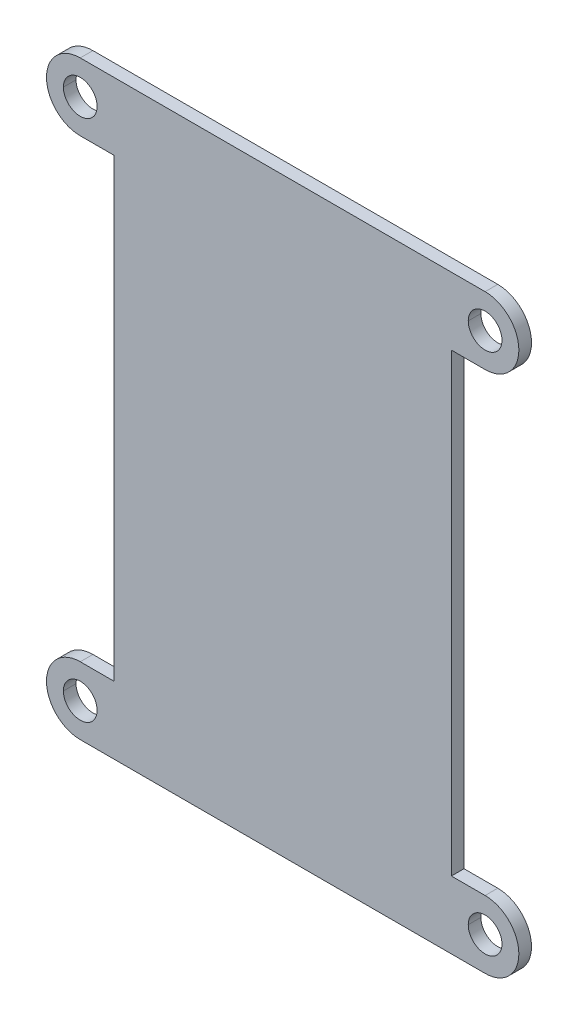
ISO-10303-21;
HEADER;
FILE_DESCRIPTION(('STEP AP214'),'2;1');
FILE_NAME('part.step','',(''),(''),'','','');
FILE_SCHEMA(('AUTOMOTIVE_DESIGN { 1 0 10303 214 1 1 1 1 }'));
ENDSEC;
DATA;
#1=APPLICATION_CONTEXT('core data for automotive mechanical design processes');
#2=APPLICATION_PROTOCOL_DEFINITION('international standard','automotive_design',2000,#1);
#3=PRODUCT_CONTEXT('',#1,'mechanical');
#4=PRODUCT('Part','Part','',(#3));
#5=PRODUCT_RELATED_PRODUCT_CATEGORY('part','',(#4));
#6=PRODUCT_DEFINITION_FORMATION('','',#4);
#7=PRODUCT_DEFINITION_CONTEXT('part definition',#1,'design');
#8=PRODUCT_DEFINITION('design','',#6,#7);
#9=PRODUCT_DEFINITION_SHAPE('','',#8);
#10=(LENGTH_UNIT() NAMED_UNIT(*) SI_UNIT(.MILLI.,.METRE.));
#11=(NAMED_UNIT(*) PLANE_ANGLE_UNIT() SI_UNIT($,.RADIAN.));
#12=(NAMED_UNIT(*) SI_UNIT($,.STERADIAN.) SOLID_ANGLE_UNIT());
#13=UNCERTAINTY_MEASURE_WITH_UNIT(LENGTH_MEASURE(1.E-05),#10,'distance_accuracy_value','');
#14=(GEOMETRIC_REPRESENTATION_CONTEXT(3) GLOBAL_UNCERTAINTY_ASSIGNED_CONTEXT((#13)) GLOBAL_UNIT_ASSIGNED_CONTEXT((#10,
#11,#12)) REPRESENTATION_CONTEXT('',''));
#15=CARTESIAN_POINT('',(0.,0.,0.));
#16=DIRECTION('',(0.,0.,1.));
#17=DIRECTION('',(1.,0.,0.));
#18=AXIS2_PLACEMENT_3D('',#15,#16,#17);
#19=CARTESIAN_POINT('',(1448.28873771887,2245.53731214958,1.5));
#20=DIRECTION('',(0.,0.,-1.));
#21=DIRECTION('',(-1.,0.,0.));
#22=AXIS2_PLACEMENT_3D('',#19,#20,#21);
#23=CYLINDRICAL_SURFACE('',#22,4.);
#24=CARTESIAN_POINT('',(1448.28873771887,2245.53731214958,1.5));
#25=DIRECTION('',(0.,0.,1.));
#26=DIRECTION('',(1.,0.,0.));
#27=AXIS2_PLACEMENT_3D('',#24,#25,#26);
#28=CIRCLE('',#27,4.);
#29=CARTESIAN_POINT('',(1444.28873771887,2245.53731214958,1.5));
#30=VERTEX_POINT('',#29);
#31=CARTESIAN_POINT('',(1448.28873771887,2241.53731214958,1.5));
#32=VERTEX_POINT('',#31);
#33=EDGE_CURVE('E42',#30,#32,#28,.T.);
#34=ORIENTED_EDGE('',*,*,#33,.F.);
#35=DIRECTION('',(0.,0.,-1.));
#36=VECTOR('',#35,1.);
#37=CARTESIAN_POINT('',(1444.28873771887,2245.53731214958,1.5));
#38=LINE('',#37,#36);
#39=CARTESIAN_POINT('',(1444.28873771887,2245.53731214958,0.));
#40=VERTEX_POINT('',#39);
#41=EDGE_CURVE('E11',#30,#40,#38,.T.);
#42=ORIENTED_EDGE('',*,*,#41,.T.);
#43=CARTESIAN_POINT('',(1448.28873771887,2245.53731214958,0.));
#44=DIRECTION('',(0.,0.,1.));
#45=DIRECTION('',(1.,0.,0.));
#46=AXIS2_PLACEMENT_3D('',#43,#44,#45);
#47=CIRCLE('',#46,4.);
#48=CARTESIAN_POINT('',(1448.28873771887,2241.53731214958,0.));
#49=VERTEX_POINT('',#48);
#50=EDGE_CURVE('E28',#40,#49,#47,.T.);
#51=ORIENTED_EDGE('',*,*,#50,.T.);
#52=DIRECTION('',(0.,0.,-1.));
#53=VECTOR('',#52,1.);
#54=CARTESIAN_POINT('',(1448.28873771887,2241.53731214958,1.5));
#55=LINE('',#54,#53);
#56=EDGE_CURVE('E300',#32,#49,#55,.T.);
#57=ORIENTED_EDGE('',*,*,#56,.F.);
#58=EDGE_LOOP('',(#34,#42,#51,#57));
#59=FACE_BOUND('',#58,.T.);
#60=ADVANCED_FACE('F17',(#59),#23,.T.);
#61=CARTESIAN_POINT('',(1496.28873771887,2245.53731214958,1.5));
#62=DIRECTION('',(0.,0.,-1.));
#63=DIRECTION('',(-1.,0.,0.));
#64=AXIS2_PLACEMENT_3D('',#61,#62,#63);
#65=CYLINDRICAL_SURFACE('',#64,1.99999999646993);
#66=CARTESIAN_POINT('',(1496.28873771887,2245.53731214958,1.5));
#67=DIRECTION('',(0.,0.,1.));
#68=DIRECTION('',(1.,0.,0.));
#69=AXIS2_PLACEMENT_3D('',#66,#67,#68);
#70=CIRCLE('',#69,1.99999999646993);
#71=CARTESIAN_POINT('',(1494.2887377224,2245.53731214958,1.5));
#72=VERTEX_POINT('',#71);
#73=CARTESIAN_POINT('',(1498.28873771534,2245.53731214958,1.5));
#74=VERTEX_POINT('',#73);
#75=EDGE_CURVE('E402',#72,#74,#70,.T.);
#76=ORIENTED_EDGE('',*,*,#75,.T.);
#77=DIRECTION('',(0.,0.,-1.));
#78=VECTOR('',#77,1.);
#79=CARTESIAN_POINT('',(1498.28873771534,2245.53731214958,1.5));
#80=LINE('',#79,#78);
#81=CARTESIAN_POINT('',(1498.28873771534,2245.53731214958,0.));
#82=VERTEX_POINT('',#81);
#83=EDGE_CURVE('E245',#74,#82,#80,.T.);
#84=ORIENTED_EDGE('',*,*,#83,.T.);
#85=CARTESIAN_POINT('',(1496.28873771887,2245.53731214958,0.));
#86=DIRECTION('',(0.,0.,1.));
#87=DIRECTION('',(1.,0.,0.));
#88=AXIS2_PLACEMENT_3D('',#85,#86,#87);
#89=CIRCLE('',#88,1.99999999646993);
#90=CARTESIAN_POINT('',(1494.2887377224,2245.53731214958,0.));
#91=VERTEX_POINT('',#90);
#92=EDGE_CURVE('E310',#91,#82,#89,.T.);
#93=ORIENTED_EDGE('',*,*,#92,.F.);
#94=DIRECTION('',(0.,0.,-1.));
#95=VECTOR('',#94,1.);
#96=CARTESIAN_POINT('',(1494.2887377224,2245.53731214958,1.5));
#97=LINE('',#96,#95);
#98=EDGE_CURVE('E423',#72,#91,#97,.T.);
#99=ORIENTED_EDGE('',*,*,#98,.F.);
#100=EDGE_LOOP('',(#76,#84,#93,#99));
#101=FACE_BOUND('',#100,.T.);
#102=ADVANCED_FACE('F490',(#101),#65,.F.);
#103=CARTESIAN_POINT('',(1448.28873771887,2245.53731214958,1.5));
#104=DIRECTION('',(0.,0.,-1.));
#105=DIRECTION('',(-1.,0.,0.));
#106=AXIS2_PLACEMENT_3D('',#103,#104,#105);
#107=CYLINDRICAL_SURFACE('',#106,2.00000000352984);
#108=CARTESIAN_POINT('',(1448.28873771887,2245.53731214958,1.5));
#109=DIRECTION('',(0.,0.,1.));
#110=DIRECTION('',(1.,0.,0.));
#111=AXIS2_PLACEMENT_3D('',#108,#109,#110);
#112=CIRCLE('',#111,2.00000000352984);
#113=CARTESIAN_POINT('',(1446.28873771534,2245.53731214958,1.5));
#114=VERTEX_POINT('',#113);
#115=CARTESIAN_POINT('',(1450.2887377224,2245.53731214958,1.5));
#116=VERTEX_POINT('',#115);
#117=EDGE_CURVE('E230',#114,#116,#112,.T.);
#118=ORIENTED_EDGE('',*,*,#117,.T.);
#119=DIRECTION('',(0.,0.,-1.));
#120=VECTOR('',#119,1.);
#121=CARTESIAN_POINT('',(1450.2887377224,2245.53731214958,1.5));
#122=LINE('',#121,#120);
#123=CARTESIAN_POINT('',(1450.2887377224,2245.53731214958,0.));
#124=VERTEX_POINT('',#123);
#125=EDGE_CURVE('E246',#116,#124,#122,.T.);
#126=ORIENTED_EDGE('',*,*,#125,.T.);
#127=CARTESIAN_POINT('',(1448.28873771887,2245.53731214958,0.));
#128=DIRECTION('',(0.,0.,1.));
#129=DIRECTION('',(1.,0.,0.));
#130=AXIS2_PLACEMENT_3D('',#127,#128,#129);
#131=CIRCLE('',#130,2.00000000352984);
#132=CARTESIAN_POINT('',(1446.28873771534,2245.53731214958,0.));
#133=VERTEX_POINT('',#132);
#134=EDGE_CURVE('E232',#133,#124,#131,.T.);
#135=ORIENTED_EDGE('',*,*,#134,.F.);
#136=DIRECTION('',(0.,0.,-1.));
#137=VECTOR('',#136,1.);
#138=CARTESIAN_POINT('',(1446.28873771534,2245.53731214958,1.5));
#139=LINE('',#138,#137);
#140=EDGE_CURVE('E226',#114,#133,#139,.T.);
#141=ORIENTED_EDGE('',*,*,#140,.F.);
#142=EDGE_LOOP('',(#118,#126,#135,#141));
#143=FACE_BOUND('',#142,.T.);
#144=ADVANCED_FACE('F228',(#143),#107,.F.);
#145=CARTESIAN_POINT('',(1496.28873771887,2307.53731214958,1.5));
#146=DIRECTION('',(0.,0.,-1.));
#147=DIRECTION('',(-1.,0.,0.));
#148=AXIS2_PLACEMENT_3D('',#145,#146,#147);
#149=CYLINDRICAL_SURFACE('',#148,1.99999999646993);
#150=CARTESIAN_POINT('',(1496.28873771887,2307.53731214958,1.5));
#151=DIRECTION('',(0.,0.,1.));
#152=DIRECTION('',(1.,0.,0.));
#153=AXIS2_PLACEMENT_3D('',#150,#151,#152);
#154=CIRCLE('',#153,1.99999999646993);
#155=CARTESIAN_POINT('',(1494.2887377224,2307.53731214958,1.5));
#156=VERTEX_POINT('',#155);
#157=CARTESIAN_POINT('',(1498.28873771534,2307.53731214958,1.5));
#158=VERTEX_POINT('',#157);
#159=EDGE_CURVE('E330',#156,#158,#154,.T.);
#160=ORIENTED_EDGE('',*,*,#159,.T.);
#161=DIRECTION('',(0.,0.,-1.));
#162=VECTOR('',#161,1.);
#163=CARTESIAN_POINT('',(1498.28873771534,2307.53731214958,1.5));
#164=LINE('',#163,#162);
#165=CARTESIAN_POINT('',(1498.28873771534,2307.53731214958,0.));
#166=VERTEX_POINT('',#165);
#167=EDGE_CURVE('E413',#158,#166,#164,.T.);
#168=ORIENTED_EDGE('',*,*,#167,.T.);
#169=CARTESIAN_POINT('',(1496.28873771887,2307.53731214958,0.));
#170=DIRECTION('',(0.,0.,1.));
#171=DIRECTION('',(1.,0.,0.));
#172=AXIS2_PLACEMENT_3D('',#169,#170,#171);
#173=CIRCLE('',#172,1.99999999646993);
#174=CARTESIAN_POINT('',(1494.2887377224,2307.53731214958,0.));
#175=VERTEX_POINT('',#174);
#176=EDGE_CURVE('E366',#175,#166,#173,.T.);
#177=ORIENTED_EDGE('',*,*,#176,.F.);
#178=DIRECTION('',(0.,0.,-1.));
#179=VECTOR('',#178,1.);
#180=CARTESIAN_POINT('',(1494.2887377224,2307.53731214958,1.5));
#181=LINE('',#180,#179);
#182=EDGE_CURVE('E249',#156,#175,#181,.T.);
#183=ORIENTED_EDGE('',*,*,#182,.F.);
#184=EDGE_LOOP('',(#160,#168,#177,#183));
#185=FACE_BOUND('',#184,.T.);
#186=ADVANCED_FACE('F822',(#185),#149,.F.);
#187=CARTESIAN_POINT('',(1448.28873771887,2307.53731214958,1.5));
#188=DIRECTION('',(0.,0.,-1.));
#189=DIRECTION('',(-1.,0.,0.));
#190=AXIS2_PLACEMENT_3D('',#187,#188,#189);
#191=CYLINDRICAL_SURFACE('',#190,2.00000000352984);
#192=CARTESIAN_POINT('',(1448.28873771887,2307.53731214958,1.5));
#193=DIRECTION('',(0.,0.,1.));
#194=DIRECTION('',(1.,0.,0.));
#195=AXIS2_PLACEMENT_3D('',#192,#193,#194);
#196=CIRCLE('',#195,2.00000000352984);
#197=CARTESIAN_POINT('',(1446.28873771534,2307.53731214958,1.5));
#198=VERTEX_POINT('',#197);
#199=CARTESIAN_POINT('',(1450.2887377224,2307.53731214958,1.5));
#200=VERTEX_POINT('',#199);
#201=EDGE_CURVE('E410',#198,#200,#196,.T.);
#202=ORIENTED_EDGE('',*,*,#201,.T.);
#203=DIRECTION('',(0.,0.,-1.));
#204=VECTOR('',#203,1.);
#205=CARTESIAN_POINT('',(1450.2887377224,2307.53731214958,1.5));
#206=LINE('',#205,#204);
#207=CARTESIAN_POINT('',(1450.2887377224,2307.53731214958,0.));
#208=VERTEX_POINT('',#207);
#209=EDGE_CURVE('E124',#200,#208,#206,.T.);
#210=ORIENTED_EDGE('',*,*,#209,.T.);
#211=CARTESIAN_POINT('',(1448.28873771887,2307.53731214958,0.));
#212=DIRECTION('',(0.,0.,1.));
#213=DIRECTION('',(1.,0.,0.));
#214=AXIS2_PLACEMENT_3D('',#211,#212,#213);
#215=CIRCLE('',#214,2.00000000352984);
#216=CARTESIAN_POINT('',(1446.28873771534,2307.53731214958,0.));
#217=VERTEX_POINT('',#216);
#218=EDGE_CURVE('E111',#217,#208,#215,.T.);
#219=ORIENTED_EDGE('',*,*,#218,.F.);
#220=DIRECTION('',(0.,0.,-1.));
#221=VECTOR('',#220,1.);
#222=CARTESIAN_POINT('',(1446.28873771534,2307.53731214958,1.5));
#223=LINE('',#222,#221);
#224=EDGE_CURVE('E387',#198,#217,#223,.T.);
#225=ORIENTED_EDGE('',*,*,#224,.F.);
#226=EDGE_LOOP('',(#202,#210,#219,#225));
#227=FACE_BOUND('',#226,.T.);
#228=ADVANCED_FACE('F470',(#227),#191,.F.);
#229=CARTESIAN_POINT('',(1448.28873771887,2307.53731214958,1.5));
#230=DIRECTION('',(0.,0.,-1.));
#231=DIRECTION('',(-1.,0.,0.));
#232=AXIS2_PLACEMENT_3D('',#229,#230,#231);
#233=CYLINDRICAL_SURFACE('',#232,4.);
#234=CARTESIAN_POINT('',(1448.28873771887,2307.53731214958,1.5));
#235=DIRECTION('',(0.,0.,1.));
#236=DIRECTION('',(1.,0.,0.));
#237=AXIS2_PLACEMENT_3D('',#234,#235,#236);
#238=CIRCLE('',#237,4.);
#239=CARTESIAN_POINT('',(1444.28873771887,2307.53731214958,1.5));
#240=VERTEX_POINT('',#239);
#241=CARTESIAN_POINT('',(1448.28873771887,2303.53731214958,1.5));
#242=VERTEX_POINT('',#241);
#243=EDGE_CURVE('E383',#240,#242,#238,.T.);
#244=ORIENTED_EDGE('',*,*,#243,.F.);
#245=DIRECTION('',(0.,0.,-1.));
#246=VECTOR('',#245,1.);
#247=CARTESIAN_POINT('',(1444.28873771887,2307.53731214958,1.5));
#248=LINE('',#247,#246);
#249=CARTESIAN_POINT('',(1444.28873771887,2307.53731214958,0.));
#250=VERTEX_POINT('',#249);
#251=EDGE_CURVE('E279',#240,#250,#248,.T.);
#252=ORIENTED_EDGE('',*,*,#251,.T.);
#253=CARTESIAN_POINT('',(1448.28873771887,2307.53731214958,0.));
#254=DIRECTION('',(0.,0.,1.));
#255=DIRECTION('',(1.,0.,0.));
#256=AXIS2_PLACEMENT_3D('',#253,#254,#255);
#257=CIRCLE('',#256,4.);
#258=CARTESIAN_POINT('',(1448.28873771887,2303.53731214958,0.));
#259=VERTEX_POINT('',#258);
#260=EDGE_CURVE('E283',#250,#259,#257,.T.);
#261=ORIENTED_EDGE('',*,*,#260,.T.);
#262=DIRECTION('',(0.,0.,-1.));
#263=VECTOR('',#262,1.);
#264=CARTESIAN_POINT('',(1448.28873771887,2303.53731214958,1.5));
#265=LINE('',#264,#263);
#266=EDGE_CURVE('E277',#242,#259,#265,.T.);
#267=ORIENTED_EDGE('',*,*,#266,.F.);
#268=EDGE_LOOP('',(#244,#252,#261,#267));
#269=FACE_BOUND('',#268,.T.);
#270=ADVANCED_FACE('F505',(#269),#233,.T.);
#271=CARTESIAN_POINT('',(0.,2241.53731214958,1.5));
#272=DIRECTION('',(0.,1.,0.));
#273=DIRECTION('',(1.,0.,0.));
#274=AXIS2_PLACEMENT_3D('',#271,#272,#273);
#275=PLANE('',#274);
#276=DIRECTION('',(1.,0.,0.));
#277=VECTOR('',#276,1.);
#278=CARTESIAN_POINT('',(0.,2241.53731214958,0.));
#279=LINE('',#278,#277);
#280=CARTESIAN_POINT('',(1496.28873771887,2241.53731214958,0.));
#281=VERTEX_POINT('',#280);
#282=EDGE_CURVE('E296',#49,#281,#279,.T.);
#283=ORIENTED_EDGE('',*,*,#282,.T.);
#284=DIRECTION('',(0.,0.,-1.));
#285=VECTOR('',#284,1.);
#286=CARTESIAN_POINT('',(1496.28873771887,2241.53731214958,1.5));
#287=LINE('',#286,#285);
#288=CARTESIAN_POINT('',(1496.28873771887,2241.53731214958,1.5));
#289=VERTEX_POINT('',#288);
#290=EDGE_CURVE('E331',#289,#281,#287,.T.);
#291=ORIENTED_EDGE('',*,*,#290,.F.);
#292=DIRECTION('',(1.,0.,0.));
#293=VECTOR('',#292,1.);
#294=CARTESIAN_POINT('',(0.,2241.53731214958,1.5));
#295=LINE('',#294,#293);
#296=EDGE_CURVE('E327',#32,#289,#295,.T.);
#297=ORIENTED_EDGE('',*,*,#296,.F.);
#298=ORIENTED_EDGE('',*,*,#56,.T.);
#299=EDGE_LOOP('',(#283,#291,#297,#298));
#300=FACE_BOUND('',#299,.T.);
#301=ADVANCED_FACE('F501',(#300),#275,.F.);
#302=CARTESIAN_POINT('',(1496.28873771887,2245.53731214958,1.5));
#303=DIRECTION('',(0.,0.,-1.));
#304=DIRECTION('',(-1.,0.,0.));
#305=AXIS2_PLACEMENT_3D('',#302,#303,#304);
#306=CYLINDRICAL_SURFACE('',#305,4.);
#307=CARTESIAN_POINT('',(1496.28873771887,2245.53731214958,0.));
#308=DIRECTION('',(0.,0.,1.));
#309=DIRECTION('',(1.,0.,0.));
#310=AXIS2_PLACEMENT_3D('',#307,#308,#309);
#311=CIRCLE('',#310,4.);
#312=CARTESIAN_POINT('',(1496.28873771887,2249.53731214958,0.));
#313=VERTEX_POINT('',#312);
#314=EDGE_CURVE('E334',#281,#313,#311,.T.);
#315=ORIENTED_EDGE('',*,*,#314,.T.);
#316=DIRECTION('',(0.,0.,-1.));
#317=VECTOR('',#316,1.);
#318=CARTESIAN_POINT('',(1496.28873771887,2249.53731214958,1.5));
#319=LINE('',#318,#317);
#320=CARTESIAN_POINT('',(1496.28873771887,2249.53731214958,1.5));
#321=VERTEX_POINT('',#320);
#322=EDGE_CURVE('E21',#321,#313,#319,.T.);
#323=ORIENTED_EDGE('',*,*,#322,.F.);
#324=CARTESIAN_POINT('',(1496.28873771887,2245.53731214958,1.5));
#325=DIRECTION('',(0.,0.,1.));
#326=DIRECTION('',(1.,0.,0.));
#327=AXIS2_PLACEMENT_3D('',#324,#325,#326);
#328=CIRCLE('',#327,4.);
#329=EDGE_CURVE('E361',#289,#321,#328,.T.);
#330=ORIENTED_EDGE('',*,*,#329,.F.);
#331=ORIENTED_EDGE('',*,*,#290,.T.);
#332=EDGE_LOOP('',(#315,#323,#330,#331));
#333=FACE_BOUND('',#332,.T.);
#334=ADVANCED_FACE('F504',(#333),#306,.T.);
#335=CARTESIAN_POINT('',(0.,2249.53731214958,1.5));
#336=DIRECTION('',(0.,-1.,0.));
#337=DIRECTION('',(0.,0.,-1.));
#338=AXIS2_PLACEMENT_3D('',#335,#336,#337);
#339=PLANE('',#338);
#340=DIRECTION('',(-1.,0.,0.));
#341=VECTOR('',#340,1.);
#342=CARTESIAN_POINT('',(0.,2249.53731214958,0.));
#343=LINE('',#342,#341);
#344=CARTESIAN_POINT('',(1492.28873771887,2249.53731214958,0.));
#345=VERTEX_POINT('',#344);
#346=EDGE_CURVE('E335',#313,#345,#343,.T.);
#347=ORIENTED_EDGE('',*,*,#346,.T.);
#348=DIRECTION('',(0.,0.,-1.));
#349=VECTOR('',#348,1.);
#350=CARTESIAN_POINT('',(1492.28873771887,2249.53731214958,1.5));
#351=LINE('',#350,#349);
#352=CARTESIAN_POINT('',(1492.28873771887,2249.53731214958,1.5));
#353=VERTEX_POINT('',#352);
#354=EDGE_CURVE('E292',#353,#345,#351,.T.);
#355=ORIENTED_EDGE('',*,*,#354,.F.);
#356=DIRECTION('',(-1.,0.,0.));
#357=VECTOR('',#356,1.);
#358=CARTESIAN_POINT('',(0.,2249.53731214958,1.5));
#359=LINE('',#358,#357);
#360=EDGE_CURVE('E372',#321,#353,#359,.T.);
#361=ORIENTED_EDGE('',*,*,#360,.F.);
#362=ORIENTED_EDGE('',*,*,#322,.T.);
#363=EDGE_LOOP('',(#347,#355,#361,#362));
#364=FACE_BOUND('',#363,.T.);
#365=ADVANCED_FACE('F507',(#364),#339,.F.);
#366=CARTESIAN_POINT('',(1492.28873771887,0.,1.5));
#367=DIRECTION('',(1.,0.,0.));
#368=DIRECTION('',(0.,1.,0.));
#369=AXIS2_PLACEMENT_3D('',#366,#367,#368);
#370=PLANE('',#369);
#371=DIRECTION('',(0.,-1.,0.));
#372=VECTOR('',#371,1.);
#373=CARTESIAN_POINT('',(1492.28873771887,0.,0.));
#374=LINE('',#373,#372);
#375=CARTESIAN_POINT('',(1492.28873771887,2303.53731214958,0.));
#376=VERTEX_POINT('',#375);
#377=EDGE_CURVE('E313',#376,#345,#374,.T.);
#378=ORIENTED_EDGE('',*,*,#377,.F.);
#379=DIRECTION('',(0.,0.,-1.));
#380=VECTOR('',#379,1.);
#381=CARTESIAN_POINT('',(1492.28873771887,2303.53731214958,1.5));
#382=LINE('',#381,#380);
#383=CARTESIAN_POINT('',(1492.28873771887,2303.53731214958,1.5));
#384=VERTEX_POINT('',#383);
#385=EDGE_CURVE('E262',#384,#376,#382,.T.);
#386=ORIENTED_EDGE('',*,*,#385,.F.);
#387=DIRECTION('',(0.,-1.,0.));
#388=VECTOR('',#387,1.);
#389=CARTESIAN_POINT('',(1492.28873771887,0.,1.5));
#390=LINE('',#389,#388);
#391=EDGE_CURVE('E288',#384,#353,#390,.T.);
#392=ORIENTED_EDGE('',*,*,#391,.T.);
#393=ORIENTED_EDGE('',*,*,#354,.T.);
#394=EDGE_LOOP('',(#378,#386,#392,#393));
#395=FACE_BOUND('',#394,.T.);
#396=ADVANCED_FACE('F510',(#395),#370,.T.);
#397=CARTESIAN_POINT('',(0.,2303.53731214958,1.5));
#398=DIRECTION('',(0.,-1.,0.));
#399=DIRECTION('',(0.,0.,-1.));
#400=AXIS2_PLACEMENT_3D('',#397,#398,#399);
#401=PLANE('',#400);
#402=DIRECTION('',(-1.,0.,0.));
#403=VECTOR('',#402,1.);
#404=CARTESIAN_POINT('',(0.,2303.53731214958,0.));
#405=LINE('',#404,#403);
#406=CARTESIAN_POINT('',(1496.28873771887,2303.53731214958,0.));
#407=VERTEX_POINT('',#406);
#408=EDGE_CURVE('E287',#407,#376,#405,.T.);
#409=ORIENTED_EDGE('',*,*,#408,.F.);
#410=DIRECTION('',(0.,0.,-1.));
#411=VECTOR('',#410,1.);
#412=CARTESIAN_POINT('',(1496.28873771887,2303.53731214958,1.5));
#413=LINE('',#412,#411);
#414=CARTESIAN_POINT('',(1496.28873771887,2303.53731214958,1.5));
#415=VERTEX_POINT('',#414);
#416=EDGE_CURVE('E318',#415,#407,#413,.T.);
#417=ORIENTED_EDGE('',*,*,#416,.F.);
#418=DIRECTION('',(-1.,0.,0.));
#419=VECTOR('',#418,1.);
#420=CARTESIAN_POINT('',(0.,2303.53731214958,1.5));
#421=LINE('',#420,#419);
#422=EDGE_CURVE('E265',#415,#384,#421,.T.);
#423=ORIENTED_EDGE('',*,*,#422,.T.);
#424=ORIENTED_EDGE('',*,*,#385,.T.);
#425=EDGE_LOOP('',(#409,#417,#423,#424));
#426=FACE_BOUND('',#425,.T.);
#427=ADVANCED_FACE('F499',(#426),#401,.T.);
#428=CARTESIAN_POINT('',(1496.28873771887,2307.53731214958,1.5));
#429=DIRECTION('',(0.,0.,-1.));
#430=DIRECTION('',(-1.,0.,0.));
#431=AXIS2_PLACEMENT_3D('',#428,#429,#430);
#432=CYLINDRICAL_SURFACE('',#431,4.);
#433=CARTESIAN_POINT('',(1496.28873771887,2307.53731214958,0.));
#434=DIRECTION('',(0.,0.,1.));
#435=DIRECTION('',(1.,0.,0.));
#436=AXIS2_PLACEMENT_3D('',#433,#434,#435);
#437=CIRCLE('',#436,4.);
#438=CARTESIAN_POINT('',(1496.28873771887,2311.53731214958,0.));
#439=VERTEX_POINT('',#438);
#440=EDGE_CURVE('E266',#407,#439,#437,.T.);
#441=ORIENTED_EDGE('',*,*,#440,.T.);
#442=DIRECTION('',(0.,0.,-1.));
#443=VECTOR('',#442,1.);
#444=CARTESIAN_POINT('',(1496.28873771887,2311.53731214958,1.5));
#445=LINE('',#444,#443);
#446=CARTESIAN_POINT('',(1496.28873771887,2311.53731214958,1.5));
#447=VERTEX_POINT('',#446);
#448=EDGE_CURVE('E355',#447,#439,#445,.T.);
#449=ORIENTED_EDGE('',*,*,#448,.F.);
#450=CARTESIAN_POINT('',(1496.28873771887,2307.53731214958,1.5));
#451=DIRECTION('',(0.,0.,1.));
#452=DIRECTION('',(1.,0.,0.));
#453=AXIS2_PLACEMENT_3D('',#450,#451,#452);
#454=CIRCLE('',#453,4.);
#455=EDGE_CURVE('E261',#415,#447,#454,.T.);
#456=ORIENTED_EDGE('',*,*,#455,.F.);
#457=ORIENTED_EDGE('',*,*,#416,.T.);
#458=EDGE_LOOP('',(#441,#449,#456,#457));
#459=FACE_BOUND('',#458,.T.);
#460=ADVANCED_FACE('F516',(#459),#432,.T.);
#461=CARTESIAN_POINT('',(0.,2311.53731214958,1.5));
#462=DIRECTION('',(0.,1.,0.));
#463=DIRECTION('',(1.,0.,0.));
#464=AXIS2_PLACEMENT_3D('',#461,#462,#463);
#465=PLANE('',#464);
#466=DIRECTION('',(1.,0.,0.));
#467=VECTOR('',#466,1.);
#468=CARTESIAN_POINT('',(0.,2311.53731214958,0.));
#469=LINE('',#468,#467);
#470=CARTESIAN_POINT('',(1448.28873771887,2311.53731214958,0.));
#471=VERTEX_POINT('',#470);
#472=EDGE_CURVE('E272',#471,#439,#469,.T.);
#473=ORIENTED_EDGE('',*,*,#472,.F.);
#474=DIRECTION('',(0.,0.,-1.));
#475=VECTOR('',#474,1.);
#476=CARTESIAN_POINT('',(1448.28873771887,2311.53731214958,1.5));
#477=LINE('',#476,#475);
#478=CARTESIAN_POINT('',(1448.28873771887,2311.53731214958,1.5));
#479=VERTEX_POINT('',#478);
#480=EDGE_CURVE('E351',#479,#471,#477,.T.);
#481=ORIENTED_EDGE('',*,*,#480,.F.);
#482=DIRECTION('',(1.,0.,0.));
#483=VECTOR('',#482,1.);
#484=CARTESIAN_POINT('',(0.,2311.53731214958,1.5));
#485=LINE('',#484,#483);
#486=EDGE_CURVE('E417',#479,#447,#485,.T.);
#487=ORIENTED_EDGE('',*,*,#486,.T.);
#488=ORIENTED_EDGE('',*,*,#448,.T.);
#489=EDGE_LOOP('',(#473,#481,#487,#488));
#490=FACE_BOUND('',#489,.T.);
#491=ADVANCED_FACE('F512',(#490),#465,.T.);
#492=CARTESIAN_POINT('',(1448.28873771887,2307.53731214958,1.5));
#493=DIRECTION('',(0.,0.,-1.));
#494=DIRECTION('',(-1.,0.,0.));
#495=AXIS2_PLACEMENT_3D('',#492,#493,#494);
#496=CYLINDRICAL_SURFACE('',#495,4.);
#497=ORIENTED_EDGE('',*,*,#251,.F.);
#498=CARTESIAN_POINT('',(1448.28873771887,2307.53731214958,1.5));
#499=DIRECTION('',(0.,0.,1.));
#500=DIRECTION('',(1.,0.,0.));
#501=AXIS2_PLACEMENT_3D('',#498,#499,#500);
#502=CIRCLE('',#501,4.);
#503=EDGE_CURVE('E379',#479,#240,#502,.T.);
#504=ORIENTED_EDGE('',*,*,#503,.F.);
#505=ORIENTED_EDGE('',*,*,#480,.T.);
#506=CARTESIAN_POINT('',(1448.28873771887,2307.53731214958,0.));
#507=DIRECTION('',(0.,0.,1.));
#508=DIRECTION('',(1.,0.,0.));
#509=AXIS2_PLACEMENT_3D('',#506,#507,#508);
#510=CIRCLE('',#509,4.);
#511=EDGE_CURVE('E345',#471,#250,#510,.T.);
#512=ORIENTED_EDGE('',*,*,#511,.T.);
#513=EDGE_LOOP('',(#497,#504,#505,#512));
#514=FACE_BOUND('',#513,.T.);
#515=ADVANCED_FACE('F515',(#514),#496,.T.);
#516=CARTESIAN_POINT('',(0.,2303.53731214958,1.5));
#517=DIRECTION('',(0.,1.,0.));
#518=DIRECTION('',(1.,0.,0.));
#519=AXIS2_PLACEMENT_3D('',#516,#517,#518);
#520=PLANE('',#519);
#521=DIRECTION('',(1.,0.,0.));
#522=VECTOR('',#521,1.);
#523=CARTESIAN_POINT('',(0.,2303.53731214958,0.));
#524=LINE('',#523,#522);
#525=CARTESIAN_POINT('',(1452.28873771887,2303.53731214958,0.));
#526=VERTEX_POINT('',#525);
#527=EDGE_CURVE('E341',#259,#526,#524,.T.);
#528=ORIENTED_EDGE('',*,*,#527,.T.);
#529=DIRECTION('',(0.,0.,-1.));
#530=VECTOR('',#529,1.);
#531=CARTESIAN_POINT('',(1452.28873771887,2303.53731214958,1.5));
#532=LINE('',#531,#530);
#533=CARTESIAN_POINT('',(1452.28873771887,2303.53731214958,1.5));
#534=VERTEX_POINT('',#533);
#535=EDGE_CURVE('E278',#534,#526,#532,.T.);
#536=ORIENTED_EDGE('',*,*,#535,.F.);
#537=DIRECTION('',(1.,0.,0.));
#538=VECTOR('',#537,1.);
#539=CARTESIAN_POINT('',(0.,2303.53731214958,1.5));
#540=LINE('',#539,#538);
#541=EDGE_CURVE('E350',#242,#534,#540,.T.);
#542=ORIENTED_EDGE('',*,*,#541,.F.);
#543=ORIENTED_EDGE('',*,*,#266,.T.);
#544=EDGE_LOOP('',(#528,#536,#542,#543));
#545=FACE_BOUND('',#544,.T.);
#546=ADVANCED_FACE('F519',(#545),#520,.F.);
#547=CARTESIAN_POINT('',(1452.28873771887,0.,1.5));
#548=DIRECTION('',(-1.,0.,0.));
#549=DIRECTION('',(0.,0.,1.));
#550=AXIS2_PLACEMENT_3D('',#547,#548,#549);
#551=PLANE('',#550);
#552=DIRECTION('',(0.,1.,0.));
#553=VECTOR('',#552,1.);
#554=CARTESIAN_POINT('',(1452.28873771887,0.,0.));
#555=LINE('',#554,#553);
#556=CARTESIAN_POINT('',(1452.28873771887,2249.53731214958,0.));
#557=VERTEX_POINT('',#556);
#558=EDGE_CURVE('E267',#557,#526,#555,.T.);
#559=ORIENTED_EDGE('',*,*,#558,.F.);
#560=DIRECTION('',(0.,0.,-1.));
#561=VECTOR('',#560,1.);
#562=CARTESIAN_POINT('',(1452.28873771887,2249.53731214958,1.5));
#563=LINE('',#562,#561);
#564=CARTESIAN_POINT('',(1452.28873771887,2249.53731214958,1.5));
#565=VERTEX_POINT('',#564);
#566=EDGE_CURVE('E305',#565,#557,#563,.T.);
#567=ORIENTED_EDGE('',*,*,#566,.F.);
#568=DIRECTION('',(0.,1.,0.));
#569=VECTOR('',#568,1.);
#570=CARTESIAN_POINT('',(1452.28873771887,0.,1.5));
#571=LINE('',#570,#569);
#572=EDGE_CURVE('E273',#565,#534,#571,.T.);
#573=ORIENTED_EDGE('',*,*,#572,.T.);
#574=ORIENTED_EDGE('',*,*,#535,.T.);
#575=EDGE_LOOP('',(#559,#567,#573,#574));
#576=FACE_BOUND('',#575,.T.);
#577=ADVANCED_FACE('F522',(#576),#551,.T.);
#578=CARTESIAN_POINT('',(0.,2249.53731214958,1.5));
#579=DIRECTION('',(0.,1.,0.));
#580=DIRECTION('',(1.,0.,0.));
#581=AXIS2_PLACEMENT_3D('',#578,#579,#580);
#582=PLANE('',#581);
#583=DIRECTION('',(1.,0.,0.));
#584=VECTOR('',#583,1.);
#585=CARTESIAN_POINT('',(0.,2249.53731214958,0.));
#586=LINE('',#585,#584);
#587=CARTESIAN_POINT('',(1448.28873771887,2249.53731214958,0.));
#588=VERTEX_POINT('',#587);
#589=EDGE_CURVE('E271',#588,#557,#586,.T.);
#590=ORIENTED_EDGE('',*,*,#589,.F.);
#591=DIRECTION('',(0.,0.,-1.));
#592=VECTOR('',#591,1.);
#593=CARTESIAN_POINT('',(1448.28873771887,2249.53731214958,1.5));
#594=LINE('',#593,#592);
#595=CARTESIAN_POINT('',(1448.28873771887,2249.53731214958,1.5));
#596=VERTEX_POINT('',#595);
#597=EDGE_CURVE('E326',#596,#588,#594,.T.);
#598=ORIENTED_EDGE('',*,*,#597,.F.);
#599=DIRECTION('',(1.,0.,0.));
#600=VECTOR('',#599,1.);
#601=CARTESIAN_POINT('',(0.,2249.53731214958,1.5));
#602=LINE('',#601,#600);
#603=EDGE_CURVE('E304',#596,#565,#602,.T.);
#604=ORIENTED_EDGE('',*,*,#603,.T.);
#605=ORIENTED_EDGE('',*,*,#566,.T.);
#606=EDGE_LOOP('',(#590,#598,#604,#605));
#607=FACE_BOUND('',#606,.T.);
#608=ADVANCED_FACE('F527',(#607),#582,.T.);
#609=CARTESIAN_POINT('',(1448.28873771887,2307.53731214958,1.5));
#610=DIRECTION('',(0.,0.,-1.));
#611=DIRECTION('',(-1.,0.,0.));
#612=AXIS2_PLACEMENT_3D('',#609,#610,#611);
#613=CYLINDRICAL_SURFACE('',#612,2.00000000352984);
#614=ORIENTED_EDGE('',*,*,#209,.F.);
#615=CARTESIAN_POINT('',(1448.28873771887,2307.53731214958,1.5));
#616=DIRECTION('',(0.,0.,1.));
#617=DIRECTION('',(1.,0.,0.));
#618=AXIS2_PLACEMENT_3D('',#615,#616,#617);
#619=CIRCLE('',#618,2.00000000352984);
#620=EDGE_CURVE('E309',#200,#198,#619,.T.);
#621=ORIENTED_EDGE('',*,*,#620,.T.);
#622=ORIENTED_EDGE('',*,*,#224,.T.);
#623=CARTESIAN_POINT('',(1448.28873771887,2307.53731214958,0.));
#624=DIRECTION('',(0.,0.,1.));
#625=DIRECTION('',(1.,0.,0.));
#626=AXIS2_PLACEMENT_3D('',#623,#624,#625);
#627=CIRCLE('',#626,2.00000000352984);
#628=EDGE_CURVE('E373',#208,#217,#627,.T.);
#629=ORIENTED_EDGE('',*,*,#628,.F.);
#630=EDGE_LOOP('',(#614,#621,#622,#629));
#631=FACE_BOUND('',#630,.T.);
#632=ADVANCED_FACE('F473',(#631),#613,.F.);
#633=CARTESIAN_POINT('',(1496.28873771887,2307.53731214958,1.5));
#634=DIRECTION('',(0.,0.,-1.));
#635=DIRECTION('',(-1.,0.,0.));
#636=AXIS2_PLACEMENT_3D('',#633,#634,#635);
#637=CYLINDRICAL_SURFACE('',#636,1.99999999646993);
#638=ORIENTED_EDGE('',*,*,#167,.F.);
#639=CARTESIAN_POINT('',(1496.28873771887,2307.53731214958,1.5));
#640=DIRECTION('',(0.,0.,1.));
#641=DIRECTION('',(1.,0.,0.));
#642=AXIS2_PLACEMENT_3D('',#639,#640,#641);
#643=CIRCLE('',#642,1.99999999646993);
#644=EDGE_CURVE('E257',#158,#156,#643,.T.);
#645=ORIENTED_EDGE('',*,*,#644,.T.);
#646=ORIENTED_EDGE('',*,*,#182,.T.);
#647=CARTESIAN_POINT('',(1496.28873771887,2307.53731214958,0.));
#648=DIRECTION('',(0.,0.,1.));
#649=DIRECTION('',(1.,0.,0.));
#650=AXIS2_PLACEMENT_3D('',#647,#648,#649);
#651=CIRCLE('',#650,1.99999999646993);
#652=EDGE_CURVE('E393',#166,#175,#651,.T.);
#653=ORIENTED_EDGE('',*,*,#652,.F.);
#654=EDGE_LOOP('',(#638,#645,#646,#653));
#655=FACE_BOUND('',#654,.T.);
#656=ADVANCED_FACE('F791',(#655),#637,.F.);
#657=CARTESIAN_POINT('',(1448.28873771887,2245.53731214958,1.5));
#658=DIRECTION('',(0.,0.,-1.));
#659=DIRECTION('',(-1.,0.,0.));
#660=AXIS2_PLACEMENT_3D('',#657,#658,#659);
#661=CYLINDRICAL_SURFACE('',#660,2.00000000352984);
#662=ORIENTED_EDGE('',*,*,#125,.F.);
#663=CARTESIAN_POINT('',(1448.28873771887,2245.53731214958,1.5));
#664=DIRECTION('',(0.,0.,1.));
#665=DIRECTION('',(1.,0.,0.));
#666=AXIS2_PLACEMENT_3D('',#663,#664,#665);
#667=CIRCLE('',#666,2.00000000352984);
#668=EDGE_CURVE('E238',#116,#114,#667,.T.);
#669=ORIENTED_EDGE('',*,*,#668,.T.);
#670=ORIENTED_EDGE('',*,*,#140,.T.);
#671=CARTESIAN_POINT('',(1448.28873771887,2245.53731214958,0.));
#672=DIRECTION('',(0.,0.,1.));
#673=DIRECTION('',(1.,0.,0.));
#674=AXIS2_PLACEMENT_3D('',#671,#672,#673);
#675=CIRCLE('',#674,2.00000000352984);
#676=EDGE_CURVE('E358',#124,#133,#675,.T.);
#677=ORIENTED_EDGE('',*,*,#676,.F.);
#678=EDGE_LOOP('',(#662,#669,#670,#677));
#679=FACE_BOUND('',#678,.T.);
#680=ADVANCED_FACE('F19',(#679),#661,.F.);
#681=CARTESIAN_POINT('',(1496.28873771887,2245.53731214958,1.5));
#682=DIRECTION('',(0.,0.,-1.));
#683=DIRECTION('',(-1.,0.,0.));
#684=AXIS2_PLACEMENT_3D('',#681,#682,#683);
#685=CYLINDRICAL_SURFACE('',#684,1.99999999646993);
#686=ORIENTED_EDGE('',*,*,#83,.F.);
#687=CARTESIAN_POINT('',(1496.28873771887,2245.53731214958,1.5));
#688=DIRECTION('',(0.,0.,1.));
#689=DIRECTION('',(1.,0.,0.));
#690=AXIS2_PLACEMENT_3D('',#687,#688,#689);
#691=CIRCLE('',#690,1.99999999646993);
#692=EDGE_CURVE('E239',#74,#72,#691,.T.);
#693=ORIENTED_EDGE('',*,*,#692,.T.);
#694=ORIENTED_EDGE('',*,*,#98,.T.);
#695=CARTESIAN_POINT('',(1496.28873771887,2245.53731214958,0.));
#696=DIRECTION('',(0.,0.,1.));
#697=DIRECTION('',(1.,0.,0.));
#698=AXIS2_PLACEMENT_3D('',#695,#696,#697);
#699=CIRCLE('',#698,1.99999999646993);
#700=EDGE_CURVE('E314',#82,#91,#699,.T.);
#701=ORIENTED_EDGE('',*,*,#700,.F.);
#702=EDGE_LOOP('',(#686,#693,#694,#701));
#703=FACE_BOUND('',#702,.T.);
#704=ADVANCED_FACE('F763',(#703),#685,.F.);
#705=CARTESIAN_POINT('',(1448.28873771887,2245.53731214958,1.5));
#706=DIRECTION('',(0.,0.,-1.));
#707=DIRECTION('',(-1.,0.,0.));
#708=AXIS2_PLACEMENT_3D('',#705,#706,#707);
#709=CYLINDRICAL_SURFACE('',#708,4.);
#710=ORIENTED_EDGE('',*,*,#41,.F.);
#711=CARTESIAN_POINT('',(1448.28873771887,2245.53731214958,1.5));
#712=DIRECTION('',(0.,0.,1.));
#713=DIRECTION('',(1.,0.,0.));
#714=AXIS2_PLACEMENT_3D('',#711,#712,#713);
#715=CIRCLE('',#714,4.);
#716=EDGE_CURVE('E346',#596,#30,#715,.T.);
#717=ORIENTED_EDGE('',*,*,#716,.F.);
#718=ORIENTED_EDGE('',*,*,#597,.T.);
#719=CARTESIAN_POINT('',(1448.28873771887,2245.53731214958,0.));
#720=DIRECTION('',(0.,0.,1.));
#721=DIRECTION('',(1.,0.,0.));
#722=AXIS2_PLACEMENT_3D('',#719,#720,#721);
#723=CIRCLE('',#722,4.);
#724=EDGE_CURVE('E322',#588,#40,#723,.T.);
#725=ORIENTED_EDGE('',*,*,#724,.T.);
#726=EDGE_LOOP('',(#710,#717,#718,#725));
#727=FACE_BOUND('',#726,.T.);
#728=ADVANCED_FACE('F482',(#727),#709,.T.);
#729=CARTESIAN_POINT('',(0.,0.,1.5));
#730=DIRECTION('',(0.,0.,1.));
#731=DIRECTION('',(1.,0.,0.));
#732=AXIS2_PLACEMENT_3D('',#729,#730,#731);
#733=PLANE('',#732);
#734=ORIENTED_EDGE('',*,*,#296,.T.);
#735=ORIENTED_EDGE('',*,*,#329,.T.);
#736=ORIENTED_EDGE('',*,*,#360,.T.);
#737=ORIENTED_EDGE('',*,*,#391,.F.);
#738=ORIENTED_EDGE('',*,*,#422,.F.);
#739=ORIENTED_EDGE('',*,*,#455,.T.);
#740=ORIENTED_EDGE('',*,*,#486,.F.);
#741=ORIENTED_EDGE('',*,*,#503,.T.);
#742=ORIENTED_EDGE('',*,*,#243,.T.);
#743=ORIENTED_EDGE('',*,*,#541,.T.);
#744=ORIENTED_EDGE('',*,*,#572,.F.);
#745=ORIENTED_EDGE('',*,*,#603,.F.);
#746=ORIENTED_EDGE('',*,*,#716,.T.);
#747=ORIENTED_EDGE('',*,*,#33,.T.);
#748=EDGE_LOOP('',(#734,#735,#736,#737,#738,#739,#740,#741,#742,#743,#744,#745,#746,#747));
#749=FACE_BOUND('',#748,.T.);
#750=ORIENTED_EDGE('',*,*,#75,.F.);
#751=ORIENTED_EDGE('',*,*,#692,.F.);
#752=EDGE_LOOP('',(#750,#751));
#753=FACE_BOUND('',#752,.T.);
#754=ORIENTED_EDGE('',*,*,#117,.F.);
#755=ORIENTED_EDGE('',*,*,#668,.F.);
#756=EDGE_LOOP('',(#754,#755));
#757=FACE_BOUND('',#756,.T.);
#758=ORIENTED_EDGE('',*,*,#159,.F.);
#759=ORIENTED_EDGE('',*,*,#644,.F.);
#760=EDGE_LOOP('',(#758,#759));
#761=FACE_BOUND('',#760,.T.);
#762=ORIENTED_EDGE('',*,*,#201,.F.);
#763=ORIENTED_EDGE('',*,*,#620,.F.);
#764=EDGE_LOOP('',(#762,#763));
#765=FACE_BOUND('',#764,.T.);
#766=ADVANCED_FACE('F242',(#749,#753,#757,#761,#765),#733,.T.);
#767=CARTESIAN_POINT('',(0.,0.,0.));
#768=DIRECTION('',(0.,0.,1.));
#769=DIRECTION('',(1.,0.,0.));
#770=AXIS2_PLACEMENT_3D('',#767,#768,#769);
#771=PLANE('',#770);
#772=ORIENTED_EDGE('',*,*,#282,.F.);
#773=ORIENTED_EDGE('',*,*,#50,.F.);
#774=ORIENTED_EDGE('',*,*,#724,.F.);
#775=ORIENTED_EDGE('',*,*,#589,.T.);
#776=ORIENTED_EDGE('',*,*,#558,.T.);
#777=ORIENTED_EDGE('',*,*,#527,.F.);
#778=ORIENTED_EDGE('',*,*,#260,.F.);
#779=ORIENTED_EDGE('',*,*,#511,.F.);
#780=ORIENTED_EDGE('',*,*,#472,.T.);
#781=ORIENTED_EDGE('',*,*,#440,.F.);
#782=ORIENTED_EDGE('',*,*,#408,.T.);
#783=ORIENTED_EDGE('',*,*,#377,.T.);
#784=ORIENTED_EDGE('',*,*,#346,.F.);
#785=ORIENTED_EDGE('',*,*,#314,.F.);
#786=EDGE_LOOP('',(#772,#773,#774,#775,#776,#777,#778,#779,#780,#781,#782,#783,#784,#785));
#787=FACE_BOUND('',#786,.T.);
#788=ORIENTED_EDGE('',*,*,#92,.T.);
#789=ORIENTED_EDGE('',*,*,#700,.T.);
#790=EDGE_LOOP('',(#788,#789));
#791=FACE_BOUND('',#790,.T.);
#792=ORIENTED_EDGE('',*,*,#134,.T.);
#793=ORIENTED_EDGE('',*,*,#676,.T.);
#794=EDGE_LOOP('',(#792,#793));
#795=FACE_BOUND('',#794,.T.);
#796=ORIENTED_EDGE('',*,*,#176,.T.);
#797=ORIENTED_EDGE('',*,*,#652,.T.);
#798=EDGE_LOOP('',(#796,#797));
#799=FACE_BOUND('',#798,.T.);
#800=ORIENTED_EDGE('',*,*,#218,.T.);
#801=ORIENTED_EDGE('',*,*,#628,.T.);
#802=EDGE_LOOP('',(#800,#801));
#803=FACE_BOUND('',#802,.T.);
#804=ADVANCED_FACE('F474',(#787,#791,#795,#799,#803),#771,.F.);
#805=CLOSED_SHELL('',(#60,#102,#144,#186,#228,#270,#301,#334,#365,#396,#427,#460,#491,#515,#546,
#577,#608,#632,#656,#680,#704,#728,#766,#804));
#806=MANIFOLD_SOLID_BREP('B1',#805);
#807=ADVANCED_BREP_SHAPE_REPRESENTATION('',(#18,#806),#14);
#808=SHAPE_DEFINITION_REPRESENTATION(#9,#807);
ENDSEC;
END-ISO-10303-21;
